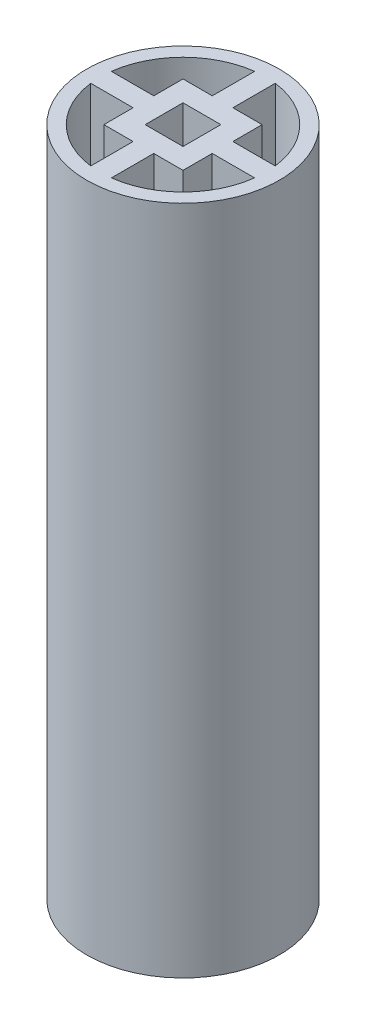
ISO-10303-21;
HEADER;
FILE_DESCRIPTION(('STEP AP214'),'2;1');
FILE_NAME('part.step','',(''),(''),'','','');
FILE_SCHEMA(('AUTOMOTIVE_DESIGN { 1 0 10303 214 1 1 1 1 }'));
ENDSEC;
DATA;
#1=APPLICATION_CONTEXT('core data for automotive mechanical design processes');
#2=APPLICATION_PROTOCOL_DEFINITION('international standard','automotive_design',2000,#1);
#3=PRODUCT_CONTEXT('',#1,'mechanical');
#4=PRODUCT('Part','Part','',(#3));
#5=PRODUCT_RELATED_PRODUCT_CATEGORY('part','',(#4));
#6=PRODUCT_DEFINITION_FORMATION('','',#4);
#7=PRODUCT_DEFINITION_CONTEXT('part definition',#1,'design');
#8=PRODUCT_DEFINITION('design','',#6,#7);
#9=PRODUCT_DEFINITION_SHAPE('','',#8);
#10=(LENGTH_UNIT() NAMED_UNIT(*) SI_UNIT(.MILLI.,.METRE.));
#11=(NAMED_UNIT(*) PLANE_ANGLE_UNIT() SI_UNIT($,.RADIAN.));
#12=(NAMED_UNIT(*) SI_UNIT($,.STERADIAN.) SOLID_ANGLE_UNIT());
#13=UNCERTAINTY_MEASURE_WITH_UNIT(LENGTH_MEASURE(1.E-05),#10,'distance_accuracy_value','');
#14=(GEOMETRIC_REPRESENTATION_CONTEXT(3) GLOBAL_UNCERTAINTY_ASSIGNED_CONTEXT((#13)) GLOBAL_UNIT_ASSIGNED_CONTEXT((#10,
#11,#12)) REPRESENTATION_CONTEXT('',''));
#15=CARTESIAN_POINT('',(0.,0.,0.));
#16=DIRECTION('',(0.,0.,1.));
#17=DIRECTION('',(1.,0.,0.));
#18=AXIS2_PLACEMENT_3D('',#15,#16,#17);
#19=CARTESIAN_POINT('',(0.,48.75,0.));
#20=DIRECTION('',(0.,1.,0.));
#21=DIRECTION('',(0.,0.,1.));
#22=AXIS2_PLACEMENT_3D('',#19,#20,#21);
#23=PLANE('',#22);
#24=CARTESIAN_POINT('',(0.,48.75,0.));
#25=DIRECTION('',(0.,1.,0.));
#26=DIRECTION('',(0.,0.,1.));
#27=AXIS2_PLACEMENT_3D('',#24,#25,#26);
#28=CIRCLE('',#27,14.);
#29=CARTESIAN_POINT('',(0.,48.75,14.));
#30=VERTEX_POINT('',#29);
#31=EDGE_CURVE('E11',#30,#30,#28,.T.);
#32=ORIENTED_EDGE('',*,*,#31,.T.);
#33=EDGE_LOOP('',(#32));
#34=FACE_BOUND('',#33,.T.);
#35=DIRECTION('',(1.,0.,0.));
#36=VECTOR('',#35,1.);
#37=CARTESIAN_POINT('',(2.75,48.75,2.75));
#38=LINE('',#37,#36);
#39=CARTESIAN_POINT('',(-2.75,48.75,2.75));
#40=VERTEX_POINT('',#39);
#41=CARTESIAN_POINT('',(2.75,48.75,2.75));
#42=VERTEX_POINT('',#41);
#43=EDGE_CURVE('E356',#40,#42,#38,.T.);
#44=ORIENTED_EDGE('',*,*,#43,.F.);
#45=DIRECTION('',(0.,0.,1.));
#46=VECTOR('',#45,1.);
#47=CARTESIAN_POINT('',(-2.75,48.75,2.75));
#48=LINE('',#47,#46);
#49=CARTESIAN_POINT('',(-2.75,48.75,-2.74999999999999));
#50=VERTEX_POINT('',#49);
#51=EDGE_CURVE('E354',#50,#40,#48,.T.);
#52=ORIENTED_EDGE('',*,*,#51,.F.);
#53=DIRECTION('',(-1.,0.,0.));
#54=VECTOR('',#53,1.);
#55=CARTESIAN_POINT('',(2.75,48.75,-2.75));
#56=LINE('',#55,#54);
#57=CARTESIAN_POINT('',(2.75,48.75,-2.75));
#58=VERTEX_POINT('',#57);
#59=EDGE_CURVE('E362',#58,#50,#56,.T.);
#60=ORIENTED_EDGE('',*,*,#59,.F.);
#61=DIRECTION('',(0.,0.,-1.));
#62=VECTOR('',#61,1.);
#63=CARTESIAN_POINT('',(2.75,48.75,2.75));
#64=LINE('',#63,#62);
#65=EDGE_CURVE('E359',#42,#58,#64,.T.);
#66=ORIENTED_EDGE('',*,*,#65,.F.);
#67=EDGE_LOOP('',(#44,#52,#60,#66));
#68=FACE_BOUND('',#67,.T.);
#69=DIRECTION('',(0.,0.,-1.));
#70=VECTOR('',#69,1.);
#71=CARTESIAN_POINT('',(-1.5,48.75,-11.9058808997907));
#72=LINE('',#71,#70);
#73=CARTESIAN_POINT('',(-1.5,48.75,-5.75));
#74=VERTEX_POINT('',#73);
#75=CARTESIAN_POINT('',(-1.5,48.75,-11.9058808997907));
#76=VERTEX_POINT('',#75);
#77=EDGE_CURVE('E318',#74,#76,#72,.T.);
#78=ORIENTED_EDGE('',*,*,#77,.F.);
#79=DIRECTION('',(1.,0.,0.));
#80=VECTOR('',#79,1.);
#81=CARTESIAN_POINT('',(-1.5,48.75,-5.75));
#82=LINE('',#81,#80);
#83=CARTESIAN_POINT('',(-5.75,48.75,-5.75));
#84=VERTEX_POINT('',#83);
#85=EDGE_CURVE('E316',#84,#74,#82,.T.);
#86=ORIENTED_EDGE('',*,*,#85,.F.);
#87=DIRECTION('',(0.,0.,-1.));
#88=VECTOR('',#87,1.);
#89=CARTESIAN_POINT('',(-5.75,48.75,-1.5));
#90=LINE('',#89,#88);
#91=CARTESIAN_POINT('',(-5.75,48.75,-1.5));
#92=VERTEX_POINT('',#91);
#93=EDGE_CURVE('E326',#92,#84,#90,.T.);
#94=ORIENTED_EDGE('',*,*,#93,.F.);
#95=DIRECTION('',(1.,0.,0.));
#96=VECTOR('',#95,1.);
#97=CARTESIAN_POINT('',(-5.75,48.75,-1.5));
#98=LINE('',#97,#96);
#99=CARTESIAN_POINT('',(-11.9058808997907,48.75,-1.5));
#100=VERTEX_POINT('',#99);
#101=EDGE_CURVE('E323',#100,#92,#98,.T.);
#102=ORIENTED_EDGE('',*,*,#101,.F.);
#103=CARTESIAN_POINT('',(0.,48.75,0.));
#104=DIRECTION('',(0.,1.,0.));
#105=DIRECTION('',(0.,0.,1.));
#106=AXIS2_PLACEMENT_3D('',#103,#104,#105);
#107=CIRCLE('',#106,12.);
#108=EDGE_CURVE('E321',#76,#100,#107,.T.);
#109=ORIENTED_EDGE('',*,*,#108,.F.);
#110=EDGE_LOOP('',(#78,#86,#94,#102,#109));
#111=FACE_BOUND('',#110,.T.);
#112=DIRECTION('',(-1.,0.,0.));
#113=VECTOR('',#112,1.);
#114=CARTESIAN_POINT('',(5.75,48.75,5.75));
#115=LINE('',#114,#113);
#116=CARTESIAN_POINT('',(5.75,48.75,5.75));
#117=VERTEX_POINT('',#116);
#118=CARTESIAN_POINT('',(1.5,48.75,5.75));
#119=VERTEX_POINT('',#118);
#120=EDGE_CURVE('E280',#117,#119,#115,.T.);
#121=ORIENTED_EDGE('',*,*,#120,.F.);
#122=DIRECTION('',(0.,0.,1.));
#123=VECTOR('',#122,1.);
#124=CARTESIAN_POINT('',(5.75,48.75,5.75));
#125=LINE('',#124,#123);
#126=CARTESIAN_POINT('',(5.75,48.75,1.5));
#127=VERTEX_POINT('',#126);
#128=EDGE_CURVE('E278',#127,#117,#125,.T.);
#129=ORIENTED_EDGE('',*,*,#128,.F.);
#130=DIRECTION('',(-1.,0.,0.));
#131=VECTOR('',#130,1.);
#132=CARTESIAN_POINT('',(5.75,48.75,1.5));
#133=LINE('',#132,#131);
#134=CARTESIAN_POINT('',(11.9058808997907,48.75,1.5));
#135=VERTEX_POINT('',#134);
#136=EDGE_CURVE('E288',#135,#127,#133,.T.);
#137=ORIENTED_EDGE('',*,*,#136,.F.);
#138=CARTESIAN_POINT('',(0.,48.75,0.));
#139=DIRECTION('',(0.,1.,0.));
#140=DIRECTION('',(0.,0.,1.));
#141=AXIS2_PLACEMENT_3D('',#138,#139,#140);
#142=CIRCLE('',#141,12.);
#143=CARTESIAN_POINT('',(1.5,48.75,11.9058808997907));
#144=VERTEX_POINT('',#143);
#145=EDGE_CURVE('E285',#144,#135,#142,.T.);
#146=ORIENTED_EDGE('',*,*,#145,.F.);
#147=DIRECTION('',(0.,0.,1.));
#148=VECTOR('',#147,1.);
#149=CARTESIAN_POINT('',(1.5,48.75,11.9058808997907));
#150=LINE('',#149,#148);
#151=EDGE_CURVE('E283',#119,#144,#150,.T.);
#152=ORIENTED_EDGE('',*,*,#151,.F.);
#153=EDGE_LOOP('',(#121,#129,#137,#146,#152));
#154=FACE_BOUND('',#153,.T.);
#155=DIRECTION('',(1.,0.,0.));
#156=VECTOR('',#155,1.);
#157=CARTESIAN_POINT('',(11.9058808997907,48.75,-1.5));
#158=LINE('',#157,#156);
#159=CARTESIAN_POINT('',(5.75,48.75,-1.5));
#160=VERTEX_POINT('',#159);
#161=CARTESIAN_POINT('',(11.9058808997907,48.75,-1.5));
#162=VERTEX_POINT('',#161);
#163=EDGE_CURVE('E242',#160,#162,#158,.T.);
#164=ORIENTED_EDGE('',*,*,#163,.F.);
#165=DIRECTION('',(0.,0.,1.));
#166=VECTOR('',#165,1.);
#167=CARTESIAN_POINT('',(5.75,48.75,-1.5));
#168=LINE('',#167,#166);
#169=CARTESIAN_POINT('',(5.75,48.75,-5.75));
#170=VERTEX_POINT('',#169);
#171=EDGE_CURVE('E240',#170,#160,#168,.T.);
#172=ORIENTED_EDGE('',*,*,#171,.F.);
#173=DIRECTION('',(1.,0.,0.));
#174=VECTOR('',#173,1.);
#175=CARTESIAN_POINT('',(5.75,48.75,-5.75));
#176=LINE('',#175,#174);
#177=CARTESIAN_POINT('',(1.5,48.75,-5.75));
#178=VERTEX_POINT('',#177);
#179=EDGE_CURVE('E250',#178,#170,#176,.T.);
#180=ORIENTED_EDGE('',*,*,#179,.F.);
#181=DIRECTION('',(0.,0.,1.));
#182=VECTOR('',#181,1.);
#183=CARTESIAN_POINT('',(1.5,48.75,-5.75));
#184=LINE('',#183,#182);
#185=CARTESIAN_POINT('',(1.5,48.75,-11.9058808997907));
#186=VERTEX_POINT('',#185);
#187=EDGE_CURVE('E247',#186,#178,#184,.T.);
#188=ORIENTED_EDGE('',*,*,#187,.F.);
#189=CARTESIAN_POINT('',(0.,48.75,0.));
#190=DIRECTION('',(0.,1.,0.));
#191=DIRECTION('',(0.,0.,1.));
#192=AXIS2_PLACEMENT_3D('',#189,#190,#191);
#193=CIRCLE('',#192,12.);
#194=EDGE_CURVE('E245',#162,#186,#193,.T.);
#195=ORIENTED_EDGE('',*,*,#194,.F.);
#196=EDGE_LOOP('',(#164,#172,#180,#188,#195));
#197=FACE_BOUND('',#196,.T.);
#198=DIRECTION('',(0.,0.,-1.));
#199=VECTOR('',#198,1.);
#200=CARTESIAN_POINT('',(-5.75,48.75,5.75));
#201=LINE('',#200,#199);
#202=CARTESIAN_POINT('',(-5.75,48.75,5.75));
#203=VERTEX_POINT('',#202);
#204=CARTESIAN_POINT('',(-5.75,48.75,1.5));
#205=VERTEX_POINT('',#204);
#206=EDGE_CURVE('E204',#203,#205,#201,.T.);
#207=ORIENTED_EDGE('',*,*,#206,.F.);
#208=DIRECTION('',(-1.,0.,0.));
#209=VECTOR('',#208,1.);
#210=CARTESIAN_POINT('',(-1.5,48.75,5.75));
#211=LINE('',#210,#209);
#212=CARTESIAN_POINT('',(-1.5,48.75,5.75));
#213=VERTEX_POINT('',#212);
#214=EDGE_CURVE('E196',#213,#203,#211,.T.);
#215=ORIENTED_EDGE('',*,*,#214,.F.);
#216=DIRECTION('',(0.,0.,-1.));
#217=VECTOR('',#216,1.);
#218=CARTESIAN_POINT('',(-1.5,48.75,5.75));
#219=LINE('',#218,#217);
#220=CARTESIAN_POINT('',(-1.5,48.75,11.9058808997907));
#221=VERTEX_POINT('',#220);
#222=EDGE_CURVE('E223',#221,#213,#219,.T.);
#223=ORIENTED_EDGE('',*,*,#222,.F.);
#224=CARTESIAN_POINT('',(0.,48.75,0.));
#225=DIRECTION('',(0.,1.,0.));
#226=DIRECTION('',(0.,0.,1.));
#227=AXIS2_PLACEMENT_3D('',#224,#225,#226);
#228=CIRCLE('',#227,12.);
#229=CARTESIAN_POINT('',(-11.9058808997907,48.75,1.5));
#230=VERTEX_POINT('',#229);
#231=EDGE_CURVE('E219',#230,#221,#228,.T.);
#232=ORIENTED_EDGE('',*,*,#231,.F.);
#233=DIRECTION('',(-1.,0.,0.));
#234=VECTOR('',#233,1.);
#235=CARTESIAN_POINT('',(-11.9058808997907,48.75,1.5));
#236=LINE('',#235,#234);
#237=EDGE_CURVE('E217',#205,#230,#236,.T.);
#238=ORIENTED_EDGE('',*,*,#237,.F.);
#239=EDGE_LOOP('',(#207,#215,#223,#232,#238));
#240=FACE_BOUND('',#239,.T.);
#241=ADVANCED_FACE('F35',(#34,#68,#111,#154,#197,#240),#23,.T.);
#242=CARTESIAN_POINT('',(0.,-48.75,0.));
#243=DIRECTION('',(0.,1.,0.));
#244=DIRECTION('',(0.,0.,1.));
#245=AXIS2_PLACEMENT_3D('',#242,#243,#244);
#246=PLANE('',#245);
#247=DIRECTION('',(0.,0.,1.));
#248=VECTOR('',#247,1.);
#249=CARTESIAN_POINT('',(5.75,-48.75,-1.5));
#250=LINE('',#249,#248);
#251=CARTESIAN_POINT('',(5.75,-48.75,-5.75));
#252=VERTEX_POINT('',#251);
#253=CARTESIAN_POINT('',(5.75,-48.75,-1.5));
#254=VERTEX_POINT('',#253);
#255=EDGE_CURVE('E212',#252,#254,#250,.T.);
#256=ORIENTED_EDGE('',*,*,#255,.T.);
#257=DIRECTION('',(1.,0.,0.));
#258=VECTOR('',#257,1.);
#259=CARTESIAN_POINT('',(11.9058808997907,-48.75,-1.5));
#260=LINE('',#259,#258);
#261=CARTESIAN_POINT('',(11.9058808997907,-48.75,-1.5));
#262=VERTEX_POINT('',#261);
#263=EDGE_CURVE('E255',#254,#262,#260,.T.);
#264=ORIENTED_EDGE('',*,*,#263,.T.);
#265=CARTESIAN_POINT('',(0.,-48.75,0.));
#266=DIRECTION('',(0.,1.,0.));
#267=DIRECTION('',(0.,0.,1.));
#268=AXIS2_PLACEMENT_3D('',#265,#266,#267);
#269=CIRCLE('',#268,12.);
#270=CARTESIAN_POINT('',(1.5,-48.75,-11.9058808997907));
#271=VERTEX_POINT('',#270);
#272=EDGE_CURVE('E258',#262,#271,#269,.T.);
#273=ORIENTED_EDGE('',*,*,#272,.T.);
#274=DIRECTION('',(0.,0.,1.));
#275=VECTOR('',#274,1.);
#276=CARTESIAN_POINT('',(1.5,-48.75,-5.75));
#277=LINE('',#276,#275);
#278=CARTESIAN_POINT('',(1.5,-48.75,-5.75));
#279=VERTEX_POINT('',#278);
#280=EDGE_CURVE('E261',#271,#279,#277,.T.);
#281=ORIENTED_EDGE('',*,*,#280,.T.);
#282=DIRECTION('',(1.,0.,0.));
#283=VECTOR('',#282,1.);
#284=CARTESIAN_POINT('',(5.75,-48.75,-5.75));
#285=LINE('',#284,#283);
#286=EDGE_CURVE('E243',#279,#252,#285,.T.);
#287=ORIENTED_EDGE('',*,*,#286,.T.);
#288=EDGE_LOOP('',(#256,#264,#273,#281,#287));
#289=FACE_BOUND('',#288,.T.);
#290=DIRECTION('',(1.,0.,0.));
#291=VECTOR('',#290,1.);
#292=CARTESIAN_POINT('',(-1.5,-48.75,-5.75));
#293=LINE('',#292,#291);
#294=CARTESIAN_POINT('',(-5.75,-48.75,-5.75));
#295=VERTEX_POINT('',#294);
#296=CARTESIAN_POINT('',(-1.5,-48.75,-5.75));
#297=VERTEX_POINT('',#296);
#298=EDGE_CURVE('E315',#295,#297,#293,.T.);
#299=ORIENTED_EDGE('',*,*,#298,.T.);
#300=DIRECTION('',(0.,0.,-1.));
#301=VECTOR('',#300,1.);
#302=CARTESIAN_POINT('',(-1.5,-48.75,-11.9058808997907));
#303=LINE('',#302,#301);
#304=CARTESIAN_POINT('',(-1.5,-48.75,-11.9058808997907));
#305=VERTEX_POINT('',#304);
#306=EDGE_CURVE('E331',#297,#305,#303,.T.);
#307=ORIENTED_EDGE('',*,*,#306,.T.);
#308=CARTESIAN_POINT('',(0.,-48.75,0.));
#309=DIRECTION('',(0.,1.,0.));
#310=DIRECTION('',(0.,0.,1.));
#311=AXIS2_PLACEMENT_3D('',#308,#309,#310);
#312=CIRCLE('',#311,12.);
#313=CARTESIAN_POINT('',(-11.9058808997907,-48.75,-1.5));
#314=VERTEX_POINT('',#313);
#315=EDGE_CURVE('E334',#305,#314,#312,.T.);
#316=ORIENTED_EDGE('',*,*,#315,.T.);
#317=DIRECTION('',(1.,0.,0.));
#318=VECTOR('',#317,1.);
#319=CARTESIAN_POINT('',(-5.75,-48.75,-1.5));
#320=LINE('',#319,#318);
#321=CARTESIAN_POINT('',(-5.75,-48.75,-1.5));
#322=VERTEX_POINT('',#321);
#323=EDGE_CURVE('E337',#314,#322,#320,.T.);
#324=ORIENTED_EDGE('',*,*,#323,.T.);
#325=DIRECTION('',(0.,0.,-1.));
#326=VECTOR('',#325,1.);
#327=CARTESIAN_POINT('',(-5.75,-48.75,-1.5));
#328=LINE('',#327,#326);
#329=EDGE_CURVE('E319',#322,#295,#328,.T.);
#330=ORIENTED_EDGE('',*,*,#329,.T.);
#331=EDGE_LOOP('',(#299,#307,#316,#324,#330));
#332=FACE_BOUND('',#331,.T.);
#333=CARTESIAN_POINT('',(0.,-48.75,0.));
#334=DIRECTION('',(0.,1.,0.));
#335=DIRECTION('',(0.,0.,1.));
#336=AXIS2_PLACEMENT_3D('',#333,#334,#335);
#337=CIRCLE('',#336,14.);
#338=CARTESIAN_POINT('',(0.,-48.75,14.));
#339=VERTEX_POINT('',#338);
#340=EDGE_CURVE('E39',#339,#339,#337,.T.);
#341=ORIENTED_EDGE('',*,*,#340,.F.);
#342=EDGE_LOOP('',(#341));
#343=FACE_BOUND('',#342,.T.);
#344=DIRECTION('',(0.,0.,1.));
#345=VECTOR('',#344,1.);
#346=CARTESIAN_POINT('',(-2.75,-48.75,2.75));
#347=LINE('',#346,#345);
#348=CARTESIAN_POINT('',(-2.75,-48.75,-2.74999999999999));
#349=VERTEX_POINT('',#348);
#350=CARTESIAN_POINT('',(-2.75,-48.75,2.75));
#351=VERTEX_POINT('',#350);
#352=EDGE_CURVE('E353',#349,#351,#347,.T.);
#353=ORIENTED_EDGE('',*,*,#352,.T.);
#354=DIRECTION('',(1.,0.,0.));
#355=VECTOR('',#354,1.);
#356=CARTESIAN_POINT('',(2.75,-48.75,2.75));
#357=LINE('',#356,#355);
#358=CARTESIAN_POINT('',(2.75,-48.75,2.75));
#359=VERTEX_POINT('',#358);
#360=EDGE_CURVE('E367',#351,#359,#357,.T.);
#361=ORIENTED_EDGE('',*,*,#360,.T.);
#362=DIRECTION('',(0.,0.,-1.));
#363=VECTOR('',#362,1.);
#364=CARTESIAN_POINT('',(2.75,-48.75,2.75));
#365=LINE('',#364,#363);
#366=CARTESIAN_POINT('',(2.75,-48.75,-2.75));
#367=VERTEX_POINT('',#366);
#368=EDGE_CURVE('E370',#359,#367,#365,.T.);
#369=ORIENTED_EDGE('',*,*,#368,.T.);
#370=DIRECTION('',(-1.,0.,0.));
#371=VECTOR('',#370,1.);
#372=CARTESIAN_POINT('',(2.75,-48.75,-2.75));
#373=LINE('',#372,#371);
#374=EDGE_CURVE('E357',#367,#349,#373,.T.);
#375=ORIENTED_EDGE('',*,*,#374,.T.);
#376=EDGE_LOOP('',(#353,#361,#369,#375));
#377=FACE_BOUND('',#376,.T.);
#378=DIRECTION('',(0.,0.,1.));
#379=VECTOR('',#378,1.);
#380=CARTESIAN_POINT('',(5.75,-48.75,5.75));
#381=LINE('',#380,#379);
#382=CARTESIAN_POINT('',(5.75,-48.75,1.5));
#383=VERTEX_POINT('',#382);
#384=CARTESIAN_POINT('',(5.75,-48.75,5.75));
#385=VERTEX_POINT('',#384);
#386=EDGE_CURVE('E277',#383,#385,#381,.T.);
#387=ORIENTED_EDGE('',*,*,#386,.T.);
#388=DIRECTION('',(-1.,0.,0.));
#389=VECTOR('',#388,1.);
#390=CARTESIAN_POINT('',(5.75,-48.75,5.75));
#391=LINE('',#390,#389);
#392=CARTESIAN_POINT('',(1.5,-48.75,5.75));
#393=VERTEX_POINT('',#392);
#394=EDGE_CURVE('E293',#385,#393,#391,.T.);
#395=ORIENTED_EDGE('',*,*,#394,.T.);
#396=DIRECTION('',(0.,0.,1.));
#397=VECTOR('',#396,1.);
#398=CARTESIAN_POINT('',(1.5,-48.75,11.9058808997907));
#399=LINE('',#398,#397);
#400=CARTESIAN_POINT('',(1.5,-48.75,11.9058808997907));
#401=VERTEX_POINT('',#400);
#402=EDGE_CURVE('E296',#393,#401,#399,.T.);
#403=ORIENTED_EDGE('',*,*,#402,.T.);
#404=CARTESIAN_POINT('',(0.,-48.75,0.));
#405=DIRECTION('',(0.,1.,0.));
#406=DIRECTION('',(0.,0.,1.));
#407=AXIS2_PLACEMENT_3D('',#404,#405,#406);
#408=CIRCLE('',#407,12.);
#409=CARTESIAN_POINT('',(11.9058808997907,-48.75,1.5));
#410=VERTEX_POINT('',#409);
#411=EDGE_CURVE('E299',#401,#410,#408,.T.);
#412=ORIENTED_EDGE('',*,*,#411,.T.);
#413=DIRECTION('',(-1.,0.,0.));
#414=VECTOR('',#413,1.);
#415=CARTESIAN_POINT('',(5.75,-48.75,1.5));
#416=LINE('',#415,#414);
#417=EDGE_CURVE('E281',#410,#383,#416,.T.);
#418=ORIENTED_EDGE('',*,*,#417,.T.);
#419=EDGE_LOOP('',(#387,#395,#403,#412,#418));
#420=FACE_BOUND('',#419,.T.);
#421=DIRECTION('',(-1.,0.,0.));
#422=VECTOR('',#421,1.);
#423=CARTESIAN_POINT('',(-1.5,-48.75,5.75));
#424=LINE('',#423,#422);
#425=CARTESIAN_POINT('',(-1.5,-48.75,5.75));
#426=VERTEX_POINT('',#425);
#427=CARTESIAN_POINT('',(-5.75,-48.75,5.75));
#428=VERTEX_POINT('',#427);
#429=EDGE_CURVE('E58',#426,#428,#424,.T.);
#430=ORIENTED_EDGE('',*,*,#429,.T.);
#431=DIRECTION('',(0.,0.,-1.));
#432=VECTOR('',#431,1.);
#433=CARTESIAN_POINT('',(-5.75,-48.75,5.75));
#434=LINE('',#433,#432);
#435=CARTESIAN_POINT('',(-5.75,-48.75,1.5));
#436=VERTEX_POINT('',#435);
#437=EDGE_CURVE('E211',#428,#436,#434,.T.);
#438=ORIENTED_EDGE('',*,*,#437,.T.);
#439=DIRECTION('',(-1.,0.,0.));
#440=VECTOR('',#439,1.);
#441=CARTESIAN_POINT('',(-11.9058808997907,-48.75,1.5));
#442=LINE('',#441,#440);
#443=CARTESIAN_POINT('',(-11.9058808997907,-48.75,1.5));
#444=VERTEX_POINT('',#443);
#445=EDGE_CURVE('E227',#436,#444,#442,.T.);
#446=ORIENTED_EDGE('',*,*,#445,.T.);
#447=CARTESIAN_POINT('',(0.,-48.75,0.));
#448=DIRECTION('',(0.,1.,0.));
#449=DIRECTION('',(0.,0.,1.));
#450=AXIS2_PLACEMENT_3D('',#447,#448,#449);
#451=CIRCLE('',#450,12.);
#452=CARTESIAN_POINT('',(-1.5,-48.75,11.9058808997907));
#453=VERTEX_POINT('',#452);
#454=EDGE_CURVE('E230',#444,#453,#451,.T.);
#455=ORIENTED_EDGE('',*,*,#454,.T.);
#456=DIRECTION('',(0.,0.,-1.));
#457=VECTOR('',#456,1.);
#458=CARTESIAN_POINT('',(-1.5,-48.75,5.75));
#459=LINE('',#458,#457);
#460=EDGE_CURVE('E205',#453,#426,#459,.T.);
#461=ORIENTED_EDGE('',*,*,#460,.T.);
#462=EDGE_LOOP('',(#430,#438,#446,#455,#461));
#463=FACE_BOUND('',#462,.T.);
#464=ADVANCED_FACE('F389',(#289,#332,#343,#377,#420,#463),#246,.F.);
#465=CARTESIAN_POINT('',(0.,48.75,0.));
#466=DIRECTION('',(0.,-1.,0.));
#467=DIRECTION('',(0.,0.,-1.));
#468=AXIS2_PLACEMENT_3D('',#465,#466,#467);
#469=CYLINDRICAL_SURFACE('',#468,14.);
#470=ORIENTED_EDGE('',*,*,#31,.F.);
#471=EDGE_LOOP('',(#470));
#472=FACE_BOUND('',#471,.T.);
#473=ORIENTED_EDGE('',*,*,#340,.T.);
#474=EDGE_LOOP('',(#473));
#475=FACE_BOUND('',#474,.T.);
#476=ADVANCED_FACE('F37',(#472,#475),#469,.T.);
#477=CARTESIAN_POINT('',(-2.75,48.75,2.75));
#478=DIRECTION('',(1.,0.,0.));
#479=DIRECTION('',(0.,0.,-1.));
#480=AXIS2_PLACEMENT_3D('',#477,#478,#479);
#481=PLANE('',#480);
#482=ORIENTED_EDGE('',*,*,#352,.F.);
#483=DIRECTION('',(0.,-1.,0.));
#484=VECTOR('',#483,1.);
#485=CARTESIAN_POINT('',(-2.75,48.75,-2.74999999999999));
#486=LINE('',#485,#484);
#487=EDGE_CURVE('E364',#50,#349,#486,.T.);
#488=ORIENTED_EDGE('',*,*,#487,.F.);
#489=ORIENTED_EDGE('',*,*,#51,.T.);
#490=DIRECTION('',(0.,-1.,0.));
#491=VECTOR('',#490,1.);
#492=CARTESIAN_POINT('',(-2.75,48.75,2.75));
#493=LINE('',#492,#491);
#494=EDGE_CURVE('E381',#40,#351,#493,.T.);
#495=ORIENTED_EDGE('',*,*,#494,.T.);
#496=EDGE_LOOP('',(#482,#488,#489,#495));
#497=FACE_BOUND('',#496,.T.);
#498=ADVANCED_FACE('F418',(#497),#481,.T.);
#499=CARTESIAN_POINT('',(2.75,48.75,2.75));
#500=DIRECTION('',(0.,0.,-1.));
#501=DIRECTION('',(-1.,0.,0.));
#502=AXIS2_PLACEMENT_3D('',#499,#500,#501);
#503=PLANE('',#502);
#504=ORIENTED_EDGE('',*,*,#360,.F.);
#505=ORIENTED_EDGE('',*,*,#494,.F.);
#506=ORIENTED_EDGE('',*,*,#43,.T.);
#507=DIRECTION('',(0.,-1.,0.));
#508=VECTOR('',#507,1.);
#509=CARTESIAN_POINT('',(2.75,48.75,2.75));
#510=LINE('',#509,#508);
#511=EDGE_CURVE('E379',#42,#359,#510,.T.);
#512=ORIENTED_EDGE('',*,*,#511,.T.);
#513=EDGE_LOOP('',(#504,#505,#506,#512));
#514=FACE_BOUND('',#513,.T.);
#515=ADVANCED_FACE('F421',(#514),#503,.T.);
#516=CARTESIAN_POINT('',(2.75,48.75,2.75));
#517=DIRECTION('',(-1.,0.,0.));
#518=DIRECTION('',(0.,0.,1.));
#519=AXIS2_PLACEMENT_3D('',#516,#517,#518);
#520=PLANE('',#519);
#521=ORIENTED_EDGE('',*,*,#368,.F.);
#522=ORIENTED_EDGE('',*,*,#511,.F.);
#523=ORIENTED_EDGE('',*,*,#65,.T.);
#524=DIRECTION('',(0.,-1.,0.));
#525=VECTOR('',#524,1.);
#526=CARTESIAN_POINT('',(2.75,48.75,-2.75));
#527=LINE('',#526,#525);
#528=EDGE_CURVE('E377',#58,#367,#527,.T.);
#529=ORIENTED_EDGE('',*,*,#528,.T.);
#530=EDGE_LOOP('',(#521,#522,#523,#529));
#531=FACE_BOUND('',#530,.T.);
#532=ADVANCED_FACE('F424',(#531),#520,.T.);
#533=CARTESIAN_POINT('',(2.75,48.75,-2.75));
#534=DIRECTION('',(0.,0.,1.));
#535=DIRECTION('',(1.,0.,0.));
#536=AXIS2_PLACEMENT_3D('',#533,#534,#535);
#537=PLANE('',#536);
#538=ORIENTED_EDGE('',*,*,#374,.F.);
#539=ORIENTED_EDGE('',*,*,#528,.F.);
#540=ORIENTED_EDGE('',*,*,#59,.T.);
#541=ORIENTED_EDGE('',*,*,#487,.T.);
#542=EDGE_LOOP('',(#538,#539,#540,#541));
#543=FACE_BOUND('',#542,.T.);
#544=ADVANCED_FACE('F428',(#543),#537,.T.);
#545=CARTESIAN_POINT('',(-1.5,48.75,-5.75));
#546=DIRECTION('',(0.,0.,-1.));
#547=DIRECTION('',(-1.,0.,0.));
#548=AXIS2_PLACEMENT_3D('',#545,#546,#547);
#549=PLANE('',#548);
#550=ORIENTED_EDGE('',*,*,#298,.F.);
#551=DIRECTION('',(0.,-1.,0.));
#552=VECTOR('',#551,1.);
#553=CARTESIAN_POINT('',(-5.75,48.75,-5.75));
#554=LINE('',#553,#552);
#555=EDGE_CURVE('E328',#84,#295,#554,.T.);
#556=ORIENTED_EDGE('',*,*,#555,.F.);
#557=ORIENTED_EDGE('',*,*,#85,.T.);
#558=DIRECTION('',(0.,-1.,0.));
#559=VECTOR('',#558,1.);
#560=CARTESIAN_POINT('',(-1.5,48.75,-5.75));
#561=LINE('',#560,#559);
#562=EDGE_CURVE('E350',#74,#297,#561,.T.);
#563=ORIENTED_EDGE('',*,*,#562,.T.);
#564=EDGE_LOOP('',(#550,#556,#557,#563));
#565=FACE_BOUND('',#564,.T.);
#566=ADVANCED_FACE('F432',(#565),#549,.T.);
#567=CARTESIAN_POINT('',(-1.5,48.75,-11.9058808997907));
#568=DIRECTION('',(-1.,0.,0.));
#569=DIRECTION('',(0.,0.,1.));
#570=AXIS2_PLACEMENT_3D('',#567,#568,#569);
#571=PLANE('',#570);
#572=ORIENTED_EDGE('',*,*,#306,.F.);
#573=ORIENTED_EDGE('',*,*,#562,.F.);
#574=ORIENTED_EDGE('',*,*,#77,.T.);
#575=DIRECTION('',(0.,-1.,0.));
#576=VECTOR('',#575,1.);
#577=CARTESIAN_POINT('',(-1.5,48.75,-11.9058808997907));
#578=LINE('',#577,#576);
#579=EDGE_CURVE('E348',#76,#305,#578,.T.);
#580=ORIENTED_EDGE('',*,*,#579,.T.);
#581=EDGE_LOOP('',(#572,#573,#574,#580));
#582=FACE_BOUND('',#581,.T.);
#583=ADVANCED_FACE('F436',(#582),#571,.T.);
#584=CARTESIAN_POINT('',(0.,48.75,0.));
#585=DIRECTION('',(0.,-1.,0.));
#586=DIRECTION('',(0.,0.,-1.));
#587=AXIS2_PLACEMENT_3D('',#584,#585,#586);
#588=CYLINDRICAL_SURFACE('',#587,12.);
#589=ORIENTED_EDGE('',*,*,#315,.F.);
#590=ORIENTED_EDGE('',*,*,#579,.F.);
#591=ORIENTED_EDGE('',*,*,#108,.T.);
#592=DIRECTION('',(0.,-1.,0.));
#593=VECTOR('',#592,1.);
#594=CARTESIAN_POINT('',(-11.9058808997907,48.75,-1.5));
#595=LINE('',#594,#593);
#596=EDGE_CURVE('E346',#100,#314,#595,.T.);
#597=ORIENTED_EDGE('',*,*,#596,.T.);
#598=EDGE_LOOP('',(#589,#590,#591,#597));
#599=FACE_BOUND('',#598,.T.);
#600=ADVANCED_FACE('F440',(#599),#588,.F.);
#601=CARTESIAN_POINT('',(-5.75,48.75,-1.5));
#602=DIRECTION('',(0.,0.,-1.));
#603=DIRECTION('',(-1.,0.,0.));
#604=AXIS2_PLACEMENT_3D('',#601,#602,#603);
#605=PLANE('',#604);
#606=ORIENTED_EDGE('',*,*,#323,.F.);
#607=ORIENTED_EDGE('',*,*,#596,.F.);
#608=ORIENTED_EDGE('',*,*,#101,.T.);
#609=DIRECTION('',(0.,-1.,0.));
#610=VECTOR('',#609,1.);
#611=CARTESIAN_POINT('',(-5.75,48.75,-1.5));
#612=LINE('',#611,#610);
#613=EDGE_CURVE('E344',#92,#322,#612,.T.);
#614=ORIENTED_EDGE('',*,*,#613,.T.);
#615=EDGE_LOOP('',(#606,#607,#608,#614));
#616=FACE_BOUND('',#615,.T.);
#617=ADVANCED_FACE('F444',(#616),#605,.T.);
#618=CARTESIAN_POINT('',(-5.75,48.75,-1.5));
#619=DIRECTION('',(-1.,0.,0.));
#620=DIRECTION('',(0.,0.,1.));
#621=AXIS2_PLACEMENT_3D('',#618,#619,#620);
#622=PLANE('',#621);
#623=ORIENTED_EDGE('',*,*,#329,.F.);
#624=ORIENTED_EDGE('',*,*,#613,.F.);
#625=ORIENTED_EDGE('',*,*,#93,.T.);
#626=ORIENTED_EDGE('',*,*,#555,.T.);
#627=EDGE_LOOP('',(#623,#624,#625,#626));
#628=FACE_BOUND('',#627,.T.);
#629=ADVANCED_FACE('F448',(#628),#622,.T.);
#630=CARTESIAN_POINT('',(5.75,48.75,5.75));
#631=DIRECTION('',(1.,0.,0.));
#632=DIRECTION('',(0.,0.,-1.));
#633=AXIS2_PLACEMENT_3D('',#630,#631,#632);
#634=PLANE('',#633);
#635=ORIENTED_EDGE('',*,*,#386,.F.);
#636=DIRECTION('',(0.,-1.,0.));
#637=VECTOR('',#636,1.);
#638=CARTESIAN_POINT('',(5.75,48.75,1.5));
#639=LINE('',#638,#637);
#640=EDGE_CURVE('E290',#127,#383,#639,.T.);
#641=ORIENTED_EDGE('',*,*,#640,.F.);
#642=ORIENTED_EDGE('',*,*,#128,.T.);
#643=DIRECTION('',(0.,-1.,0.));
#644=VECTOR('',#643,1.);
#645=CARTESIAN_POINT('',(5.75,48.75,5.75));
#646=LINE('',#645,#644);
#647=EDGE_CURVE('E312',#117,#385,#646,.T.);
#648=ORIENTED_EDGE('',*,*,#647,.T.);
#649=EDGE_LOOP('',(#635,#641,#642,#648));
#650=FACE_BOUND('',#649,.T.);
#651=ADVANCED_FACE('F452',(#650),#634,.T.);
#652=CARTESIAN_POINT('',(5.75,48.75,5.75));
#653=DIRECTION('',(0.,0.,1.));
#654=DIRECTION('',(1.,0.,0.));
#655=AXIS2_PLACEMENT_3D('',#652,#653,#654);
#656=PLANE('',#655);
#657=ORIENTED_EDGE('',*,*,#394,.F.);
#658=ORIENTED_EDGE('',*,*,#647,.F.);
#659=ORIENTED_EDGE('',*,*,#120,.T.);
#660=DIRECTION('',(0.,-1.,0.));
#661=VECTOR('',#660,1.);
#662=CARTESIAN_POINT('',(1.5,48.75,5.75));
#663=LINE('',#662,#661);
#664=EDGE_CURVE('E310',#119,#393,#663,.T.);
#665=ORIENTED_EDGE('',*,*,#664,.T.);
#666=EDGE_LOOP('',(#657,#658,#659,#665));
#667=FACE_BOUND('',#666,.T.);
#668=ADVANCED_FACE('F456',(#667),#656,.T.);
#669=CARTESIAN_POINT('',(1.5,48.75,11.9058808997907));
#670=DIRECTION('',(1.,0.,0.));
#671=DIRECTION('',(0.,0.,-1.));
#672=AXIS2_PLACEMENT_3D('',#669,#670,#671);
#673=PLANE('',#672);
#674=ORIENTED_EDGE('',*,*,#402,.F.);
#675=ORIENTED_EDGE('',*,*,#664,.F.);
#676=ORIENTED_EDGE('',*,*,#151,.T.);
#677=DIRECTION('',(0.,-1.,0.));
#678=VECTOR('',#677,1.);
#679=CARTESIAN_POINT('',(1.5,48.75,11.9058808997907));
#680=LINE('',#679,#678);
#681=EDGE_CURVE('E308',#144,#401,#680,.T.);
#682=ORIENTED_EDGE('',*,*,#681,.T.);
#683=EDGE_LOOP('',(#674,#675,#676,#682));
#684=FACE_BOUND('',#683,.T.);
#685=ADVANCED_FACE('F460',(#684),#673,.T.);
#686=CARTESIAN_POINT('',(0.,48.75,0.));
#687=DIRECTION('',(0.,-1.,0.));
#688=DIRECTION('',(0.,0.,-1.));
#689=AXIS2_PLACEMENT_3D('',#686,#687,#688);
#690=CYLINDRICAL_SURFACE('',#689,12.);
#691=ORIENTED_EDGE('',*,*,#411,.F.);
#692=ORIENTED_EDGE('',*,*,#681,.F.);
#693=ORIENTED_EDGE('',*,*,#145,.T.);
#694=DIRECTION('',(0.,-1.,0.));
#695=VECTOR('',#694,1.);
#696=CARTESIAN_POINT('',(11.9058808997907,48.75,1.5));
#697=LINE('',#696,#695);
#698=EDGE_CURVE('E306',#135,#410,#697,.T.);
#699=ORIENTED_EDGE('',*,*,#698,.T.);
#700=EDGE_LOOP('',(#691,#692,#693,#699));
#701=FACE_BOUND('',#700,.T.);
#702=ADVANCED_FACE('F464',(#701),#690,.F.);
#703=CARTESIAN_POINT('',(5.75,48.75,1.5));
#704=DIRECTION('',(0.,0.,1.));
#705=DIRECTION('',(1.,0.,0.));
#706=AXIS2_PLACEMENT_3D('',#703,#704,#705);
#707=PLANE('',#706);
#708=ORIENTED_EDGE('',*,*,#417,.F.);
#709=ORIENTED_EDGE('',*,*,#698,.F.);
#710=ORIENTED_EDGE('',*,*,#136,.T.);
#711=ORIENTED_EDGE('',*,*,#640,.T.);
#712=EDGE_LOOP('',(#708,#709,#710,#711));
#713=FACE_BOUND('',#712,.T.);
#714=ADVANCED_FACE('F468',(#713),#707,.T.);
#715=CARTESIAN_POINT('',(5.75,48.75,-1.5));
#716=DIRECTION('',(1.,0.,0.));
#717=DIRECTION('',(0.,0.,-1.));
#718=AXIS2_PLACEMENT_3D('',#715,#716,#717);
#719=PLANE('',#718);
#720=ORIENTED_EDGE('',*,*,#255,.F.);
#721=DIRECTION('',(0.,-1.,0.));
#722=VECTOR('',#721,1.);
#723=CARTESIAN_POINT('',(5.75,48.75,-5.75));
#724=LINE('',#723,#722);
#725=EDGE_CURVE('E252',#170,#252,#724,.T.);
#726=ORIENTED_EDGE('',*,*,#725,.F.);
#727=ORIENTED_EDGE('',*,*,#171,.T.);
#728=DIRECTION('',(0.,-1.,0.));
#729=VECTOR('',#728,1.);
#730=CARTESIAN_POINT('',(5.75,48.75,-1.5));
#731=LINE('',#730,#729);
#732=EDGE_CURVE('E274',#160,#254,#731,.T.);
#733=ORIENTED_EDGE('',*,*,#732,.T.);
#734=EDGE_LOOP('',(#720,#726,#727,#733));
#735=FACE_BOUND('',#734,.T.);
#736=ADVANCED_FACE('F472',(#735),#719,.T.);
#737=CARTESIAN_POINT('',(11.9058808997907,48.75,-1.5));
#738=DIRECTION('',(0.,0.,-1.));
#739=DIRECTION('',(-1.,0.,0.));
#740=AXIS2_PLACEMENT_3D('',#737,#738,#739);
#741=PLANE('',#740);
#742=ORIENTED_EDGE('',*,*,#263,.F.);
#743=ORIENTED_EDGE('',*,*,#732,.F.);
#744=ORIENTED_EDGE('',*,*,#163,.T.);
#745=DIRECTION('',(0.,-1.,0.));
#746=VECTOR('',#745,1.);
#747=CARTESIAN_POINT('',(11.9058808997907,48.75,-1.5));
#748=LINE('',#747,#746);
#749=EDGE_CURVE('E272',#162,#262,#748,.T.);
#750=ORIENTED_EDGE('',*,*,#749,.T.);
#751=EDGE_LOOP('',(#742,#743,#744,#750));
#752=FACE_BOUND('',#751,.T.);
#753=ADVANCED_FACE('F476',(#752),#741,.T.);
#754=CARTESIAN_POINT('',(0.,48.75,0.));
#755=DIRECTION('',(0.,-1.,0.));
#756=DIRECTION('',(0.,0.,-1.));
#757=AXIS2_PLACEMENT_3D('',#754,#755,#756);
#758=CYLINDRICAL_SURFACE('',#757,12.);
#759=ORIENTED_EDGE('',*,*,#272,.F.);
#760=ORIENTED_EDGE('',*,*,#749,.F.);
#761=ORIENTED_EDGE('',*,*,#194,.T.);
#762=DIRECTION('',(0.,-1.,0.));
#763=VECTOR('',#762,1.);
#764=CARTESIAN_POINT('',(1.5,48.75,-11.9058808997907));
#765=LINE('',#764,#763);
#766=EDGE_CURVE('E270',#186,#271,#765,.T.);
#767=ORIENTED_EDGE('',*,*,#766,.T.);
#768=EDGE_LOOP('',(#759,#760,#761,#767));
#769=FACE_BOUND('',#768,.T.);
#770=ADVANCED_FACE('F480',(#769),#758,.F.);
#771=CARTESIAN_POINT('',(1.5,48.75,-5.75));
#772=DIRECTION('',(1.,0.,0.));
#773=DIRECTION('',(0.,0.,-1.));
#774=AXIS2_PLACEMENT_3D('',#771,#772,#773);
#775=PLANE('',#774);
#776=ORIENTED_EDGE('',*,*,#280,.F.);
#777=ORIENTED_EDGE('',*,*,#766,.F.);
#778=ORIENTED_EDGE('',*,*,#187,.T.);
#779=DIRECTION('',(0.,-1.,0.));
#780=VECTOR('',#779,1.);
#781=CARTESIAN_POINT('',(1.5,48.75,-5.75));
#782=LINE('',#781,#780);
#783=EDGE_CURVE('E268',#178,#279,#782,.T.);
#784=ORIENTED_EDGE('',*,*,#783,.T.);
#785=EDGE_LOOP('',(#776,#777,#778,#784));
#786=FACE_BOUND('',#785,.T.);
#787=ADVANCED_FACE('F484',(#786),#775,.T.);
#788=CARTESIAN_POINT('',(5.75,48.75,-5.75));
#789=DIRECTION('',(0.,0.,-1.));
#790=DIRECTION('',(-1.,0.,0.));
#791=AXIS2_PLACEMENT_3D('',#788,#789,#790);
#792=PLANE('',#791);
#793=ORIENTED_EDGE('',*,*,#286,.F.);
#794=ORIENTED_EDGE('',*,*,#783,.F.);
#795=ORIENTED_EDGE('',*,*,#179,.T.);
#796=ORIENTED_EDGE('',*,*,#725,.T.);
#797=EDGE_LOOP('',(#793,#794,#795,#796));
#798=FACE_BOUND('',#797,.T.);
#799=ADVANCED_FACE('F488',(#798),#792,.T.);
#800=CARTESIAN_POINT('',(-1.5,48.75,5.75));
#801=DIRECTION('',(0.,0.,1.));
#802=DIRECTION('',(1.,0.,0.));
#803=AXIS2_PLACEMENT_3D('',#800,#801,#802);
#804=PLANE('',#803);
#805=ORIENTED_EDGE('',*,*,#429,.F.);
#806=DIRECTION('',(0.,-1.,0.));
#807=VECTOR('',#806,1.);
#808=CARTESIAN_POINT('',(-1.5,48.75,5.75));
#809=LINE('',#808,#807);
#810=EDGE_CURVE('E200',#213,#426,#809,.T.);
#811=ORIENTED_EDGE('',*,*,#810,.F.);
#812=ORIENTED_EDGE('',*,*,#214,.T.);
#813=DIRECTION('',(0.,-1.,0.));
#814=VECTOR('',#813,1.);
#815=CARTESIAN_POINT('',(-5.75,48.75,5.75));
#816=LINE('',#815,#814);
#817=EDGE_CURVE('E199',#203,#428,#816,.T.);
#818=ORIENTED_EDGE('',*,*,#817,.T.);
#819=EDGE_LOOP('',(#805,#811,#812,#818));
#820=FACE_BOUND('',#819,.T.);
#821=ADVANCED_FACE('F198',(#820),#804,.T.);
#822=CARTESIAN_POINT('',(-5.75,48.75,5.75));
#823=DIRECTION('',(-1.,0.,0.));
#824=DIRECTION('',(0.,0.,1.));
#825=AXIS2_PLACEMENT_3D('',#822,#823,#824);
#826=PLANE('',#825);
#827=ORIENTED_EDGE('',*,*,#437,.F.);
#828=ORIENTED_EDGE('',*,*,#817,.F.);
#829=ORIENTED_EDGE('',*,*,#206,.T.);
#830=DIRECTION('',(0.,-1.,0.));
#831=VECTOR('',#830,1.);
#832=CARTESIAN_POINT('',(-5.75,48.75,1.5));
#833=LINE('',#832,#831);
#834=EDGE_CURVE('E213',#205,#436,#833,.T.);
#835=ORIENTED_EDGE('',*,*,#834,.T.);
#836=EDGE_LOOP('',(#827,#828,#829,#835));
#837=FACE_BOUND('',#836,.T.);
#838=ADVANCED_FACE('F208',(#837),#826,.T.);
#839=CARTESIAN_POINT('',(-11.9058808997907,48.75,1.5));
#840=DIRECTION('',(0.,0.,1.));
#841=DIRECTION('',(1.,0.,0.));
#842=AXIS2_PLACEMENT_3D('',#839,#840,#841);
#843=PLANE('',#842);
#844=ORIENTED_EDGE('',*,*,#445,.F.);
#845=ORIENTED_EDGE('',*,*,#834,.F.);
#846=ORIENTED_EDGE('',*,*,#237,.T.);
#847=DIRECTION('',(0.,-1.,0.));
#848=VECTOR('',#847,1.);
#849=CARTESIAN_POINT('',(-11.9058808997907,48.75,1.5));
#850=LINE('',#849,#848);
#851=EDGE_CURVE('E237',#230,#444,#850,.T.);
#852=ORIENTED_EDGE('',*,*,#851,.T.);
#853=EDGE_LOOP('',(#844,#845,#846,#852));
#854=FACE_BOUND('',#853,.T.);
#855=ADVANCED_FACE('F402',(#854),#843,.T.);
#856=CARTESIAN_POINT('',(0.,48.75,0.));
#857=DIRECTION('',(0.,-1.,0.));
#858=DIRECTION('',(0.,0.,-1.));
#859=AXIS2_PLACEMENT_3D('',#856,#857,#858);
#860=CYLINDRICAL_SURFACE('',#859,12.);
#861=ORIENTED_EDGE('',*,*,#454,.F.);
#862=ORIENTED_EDGE('',*,*,#851,.F.);
#863=ORIENTED_EDGE('',*,*,#231,.T.);
#864=DIRECTION('',(0.,-1.,0.));
#865=VECTOR('',#864,1.);
#866=CARTESIAN_POINT('',(-1.5,48.75,11.9058808997907));
#867=LINE('',#866,#865);
#868=EDGE_CURVE('E50',#221,#453,#867,.T.);
#869=ORIENTED_EDGE('',*,*,#868,.T.);
#870=EDGE_LOOP('',(#861,#862,#863,#869));
#871=FACE_BOUND('',#870,.T.);
#872=ADVANCED_FACE('F399',(#871),#860,.F.);
#873=CARTESIAN_POINT('',(-1.5,48.75,5.75));
#874=DIRECTION('',(-1.,0.,0.));
#875=DIRECTION('',(0.,0.,1.));
#876=AXIS2_PLACEMENT_3D('',#873,#874,#875);
#877=PLANE('',#876);
#878=ORIENTED_EDGE('',*,*,#460,.F.);
#879=ORIENTED_EDGE('',*,*,#868,.F.);
#880=ORIENTED_EDGE('',*,*,#222,.T.);
#881=ORIENTED_EDGE('',*,*,#810,.T.);
#882=EDGE_LOOP('',(#878,#879,#880,#881));
#883=FACE_BOUND('',#882,.T.);
#884=ADVANCED_FACE('F396',(#883),#877,.T.);
#885=CLOSED_SHELL('',(#241,#464,#476,#498,#515,#532,#544,#566,#583,#600,#617,#629,#651,#668,
#685,#702,#714,#736,#753,#770,#787,#799,#821,#838,#855,#872,#884));
#886=MANIFOLD_SOLID_BREP('B2',#885);
#887=ADVANCED_BREP_SHAPE_REPRESENTATION('',(#18,#886),#14);
#888=SHAPE_DEFINITION_REPRESENTATION(#9,#887);
ENDSEC;
END-ISO-10303-21;
